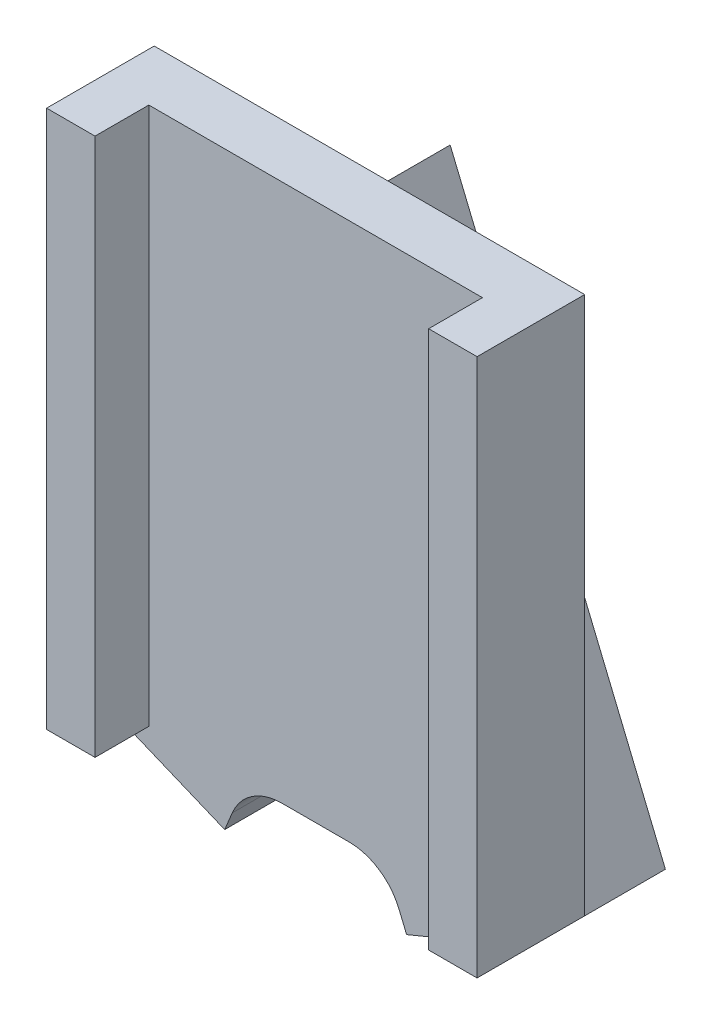
ISO-10303-21;
HEADER;
FILE_DESCRIPTION(('STEP AP214'),'2;1');
FILE_NAME('part.step','',(''),(''),'','','');
FILE_SCHEMA(('AUTOMOTIVE_DESIGN { 1 0 10303 214 1 1 1 1 }'));
ENDSEC;
DATA;
#1=APPLICATION_CONTEXT('core data for automotive mechanical design processes');
#2=APPLICATION_PROTOCOL_DEFINITION('international standard','automotive_design',2000,#1);
#3=PRODUCT_CONTEXT('',#1,'mechanical');
#4=PRODUCT('Part','Part','',(#3));
#5=PRODUCT_RELATED_PRODUCT_CATEGORY('part','',(#4));
#6=PRODUCT_DEFINITION_FORMATION('','',#4);
#7=PRODUCT_DEFINITION_CONTEXT('part definition',#1,'design');
#8=PRODUCT_DEFINITION('design','',#6,#7);
#9=PRODUCT_DEFINITION_SHAPE('','',#8);
#10=(LENGTH_UNIT() NAMED_UNIT(*) SI_UNIT(.MILLI.,.METRE.));
#11=(NAMED_UNIT(*) PLANE_ANGLE_UNIT() SI_UNIT($,.RADIAN.));
#12=(NAMED_UNIT(*) SI_UNIT($,.STERADIAN.) SOLID_ANGLE_UNIT());
#13=UNCERTAINTY_MEASURE_WITH_UNIT(LENGTH_MEASURE(1.E-05),#10,'distance_accuracy_value','');
#14=(GEOMETRIC_REPRESENTATION_CONTEXT(3) GLOBAL_UNCERTAINTY_ASSIGNED_CONTEXT((#13)) GLOBAL_UNIT_ASSIGNED_CONTEXT((#10,
#11,#12)) REPRESENTATION_CONTEXT('',''));
#15=CARTESIAN_POINT('',(0.,0.,0.));
#16=DIRECTION('',(0.,0.,1.));
#17=DIRECTION('',(1.,0.,0.));
#18=AXIS2_PLACEMENT_3D('',#15,#16,#17);
#19=CARTESIAN_POINT('',(2.30969883127822,-10.9567085809127,1.));
#20=DIRECTION('',(0.923879532511288,-0.382683432365087,0.));
#21=DIRECTION('',(0.382683432365087,0.923879532511288,0.));
#22=AXIS2_PLACEMENT_3D('',#19,#20,#21);
#23=PLANE('',#22);
#24=DIRECTION('',(0.382683432365087,0.923879532511288,0.));
#25=VECTOR('',#24,1.);
#26=CARTESIAN_POINT('',(5.84523273721094,-2.42117467497996,0.));
#27=LINE('',#26,#25);
#28=CARTESIAN_POINT('',(2.450279606139,-10.6173165676349,0.));
#29=VERTEX_POINT('',#28);
#30=CARTESIAN_POINT('',(3.71016818448233,-7.57567647471944,0.));
#31=VERTEX_POINT('',#30);
#32=EDGE_CURVE('E206',#29,#31,#27,.T.);
#33=ORIENTED_EDGE('',*,*,#32,.F.);
#34=DIRECTION('',(0.,0.,-1.));
#35=VECTOR('',#34,1.);
#36=CARTESIAN_POINT('',(2.450279606139,-10.6173165676349,1.));
#37=LINE('',#36,#35);
#38=CARTESIAN_POINT('',(2.450279606139,-10.6173165676349,1.));
#39=VERTEX_POINT('',#38);
#40=EDGE_CURVE('E295',#29,#39,#37,.F.);
#41=ORIENTED_EDGE('',*,*,#40,.T.);
#42=DIRECTION('',(-0.382683432365087,-0.923879532511288,0.));
#43=VECTOR('',#42,1.);
#44=CARTESIAN_POINT('',(2.30969883127822,-10.9567085809127,1.));
#45=LINE('',#44,#43);
#46=CARTESIAN_POINT('',(2.30969883127822,-10.9567085809127,1.));
#47=VERTEX_POINT('',#46);
#48=EDGE_CURVE('E307',#39,#47,#45,.T.);
#49=ORIENTED_EDGE('',*,*,#48,.T.);
#50=DIRECTION('',(0.,0.,-1.));
#51=VECTOR('',#50,1.);
#52=CARTESIAN_POINT('',(2.30969883127822,-10.9567085809127,1.));
#53=LINE('',#52,#51);
#54=CARTESIAN_POINT('',(2.30969883127822,-10.9567085809127,-1.5));
#55=VERTEX_POINT('',#54);
#56=EDGE_CURVE('E347',#47,#55,#53,.T.);
#57=ORIENTED_EDGE('',*,*,#56,.T.);
#58=DIRECTION('',(-0.382683432365087,-0.923879532511288,0.));
#59=VECTOR('',#58,1.);
#60=CARTESIAN_POINT('',(2.30969883127822,-10.9567085809127,-1.5));
#61=LINE('',#60,#59);
#62=CARTESIAN_POINT('',(3.71016818448233,-7.57567647471944,-1.5));
#63=VERTEX_POINT('',#62);
#64=EDGE_CURVE('E360',#63,#55,#61,.T.);
#65=ORIENTED_EDGE('',*,*,#64,.F.);
#66=DIRECTION('',(0.,0.,-1.));
#67=VECTOR('',#66,1.);
#68=CARTESIAN_POINT('',(3.71016818448233,-7.57567647471944,0.));
#69=LINE('',#68,#67);
#70=EDGE_CURVE('E197',#31,#63,#69,.T.);
#71=ORIENTED_EDGE('',*,*,#70,.F.);
#72=EDGE_LOOP('',(#33,#41,#49,#57,#65,#71));
#73=FACE_BOUND('',#72,.T.);
#74=ADVANCED_FACE('F32',(#73),#23,.T.);
#75=CARTESIAN_POINT('',(3.99999999999999,-6.8759605748895,1.));
#76=DIRECTION('',(-0.923879532511288,-0.382683432365088,0.));
#77=DIRECTION('',(0.382683432365088,-0.923879532511288,0.));
#78=AXIS2_PLACEMENT_3D('',#75,#76,#77);
#79=PLANE('',#78);
#80=DIRECTION('',(0.,0.,-1.));
#81=VECTOR('',#80,1.);
#82=CARTESIAN_POINT('',(4.01000933746841,-6.90012525315614,0.));
#83=LINE('',#82,#81);
#84=CARTESIAN_POINT('',(4.01000933746841,-6.90012525315614,0.));
#85=VERTEX_POINT('',#84);
#86=CARTESIAN_POINT('',(4.01000933746841,-6.90012525315614,-1.5));
#87=VERTEX_POINT('',#86);
#88=EDGE_CURVE('E198',#85,#87,#83,.T.);
#89=ORIENTED_EDGE('',*,*,#88,.F.);
#90=DIRECTION('',(0.382683432365088,-0.923879532511288,0.));
#91=VECTOR('',#90,1.);
#92=CARTESIAN_POINT('',(0.983194387535245,0.407252449766205,0.));
#93=LINE('',#92,#91);
#94=CARTESIAN_POINT('',(3.99999999999999,-6.8759605748895,0.));
#95=VERTEX_POINT('',#94);
#96=EDGE_CURVE('E213',#95,#85,#93,.T.);
#97=ORIENTED_EDGE('',*,*,#96,.F.);
#98=DIRECTION('',(0.,0.,-1.));
#99=VECTOR('',#98,1.);
#100=CARTESIAN_POINT('',(3.99999999999999,-6.8759605748895,1.));
#101=LINE('',#100,#99);
#102=CARTESIAN_POINT('',(3.99999999999999,-6.8759605748895,-1.5));
#103=VERTEX_POINT('',#102);
#104=EDGE_CURVE('E212',#95,#103,#101,.T.);
#105=ORIENTED_EDGE('',*,*,#104,.T.);
#106=DIRECTION('',(-0.382683432365088,0.923879532511288,0.));
#107=VECTOR('',#106,1.);
#108=CARTESIAN_POINT('',(3.99999999999999,-6.8759605748895,-1.5));
#109=LINE('',#108,#107);
#110=EDGE_CURVE('E361',#87,#103,#109,.T.);
#111=ORIENTED_EDGE('',*,*,#110,.F.);
#112=EDGE_LOOP('',(#89,#97,#105,#111));
#113=FACE_BOUND('',#112,.T.);
#114=ADVANCED_FACE('F436',(#113),#79,.T.);
#115=CARTESIAN_POINT('',(0.,-10.,2.));
#116=DIRECTION('',(0.,1.,0.));
#117=DIRECTION('',(0.,0.,1.));
#118=AXIS2_PLACEMENT_3D('',#115,#116,#117);
#119=PLANE('',#118);
#120=DIRECTION('',(1.,0.,0.));
#121=VECTOR('',#120,1.);
#122=CARTESIAN_POINT('',(0.900000000000001,-10.,1.));
#123=LINE('',#122,#121);
#124=CARTESIAN_POINT('',(3.37415913865028,-10.,1.));
#125=VERTEX_POINT('',#124);
#126=CARTESIAN_POINT('',(4.6258408613497,-10.,1.));
#127=VERTEX_POINT('',#126);
#128=EDGE_CURVE('E230',#125,#127,#123,.T.);
#129=ORIENTED_EDGE('',*,*,#128,.F.);
#130=DIRECTION('',(0.,0.,-1.));
#131=VECTOR('',#130,1.);
#132=CARTESIAN_POINT('',(3.37415913865028,-10.,2.));
#133=LINE('',#132,#131);
#134=CARTESIAN_POINT('',(3.37415913865028,-10.,0.));
#135=VERTEX_POINT('',#134);
#136=EDGE_CURVE('E292',#125,#135,#133,.T.);
#137=ORIENTED_EDGE('',*,*,#136,.T.);
#138=DIRECTION('',(1.,0.,0.));
#139=VECTOR('',#138,1.);
#140=CARTESIAN_POINT('',(0.,-10.,0.));
#141=LINE('',#140,#139);
#142=CARTESIAN_POINT('',(4.6258408613497,-10.,0.));
#143=VERTEX_POINT('',#142);
#144=EDGE_CURVE('E269',#135,#143,#141,.T.);
#145=ORIENTED_EDGE('',*,*,#144,.T.);
#146=DIRECTION('',(0.,0.,1.));
#147=VECTOR('',#146,1.);
#148=CARTESIAN_POINT('',(4.6258408613497,-10.,2.));
#149=LINE('',#148,#147);
#150=EDGE_CURVE('E289',#143,#127,#149,.T.);
#151=ORIENTED_EDGE('',*,*,#150,.T.);
#152=EDGE_LOOP('',(#129,#137,#145,#151));
#153=FACE_BOUND('',#152,.T.);
#154=ADVANCED_FACE('F312',(#153),#119,.F.);
#155=DIRECTION('',(0.,0.,-1.));
#156=VECTOR('',#155,1.);
#157=CARTESIAN_POINT('',(0.,-10.,2.));
#158=LINE('',#157,#156);
#159=CARTESIAN_POINT('',(0.,-10.,2.));
#160=VERTEX_POINT('',#159);
#161=CARTESIAN_POINT('',(0.,-10.,1.));
#162=VERTEX_POINT('',#161);
#163=EDGE_CURVE('E283',#160,#162,#158,.T.);
#164=ORIENTED_EDGE('',*,*,#163,.T.);
#165=DIRECTION('',(1.,0.,0.));
#166=VECTOR('',#165,1.);
#167=CARTESIAN_POINT('',(0.,-10.,1.));
#168=LINE('',#167,#166);
#169=CARTESIAN_POINT('',(0.900000000000001,-10.,1.));
#170=VERTEX_POINT('',#169);
#171=EDGE_CURVE('E227',#162,#170,#168,.T.);
#172=ORIENTED_EDGE('',*,*,#171,.T.);
#173=DIRECTION('',(0.,0.,1.));
#174=VECTOR('',#173,1.);
#175=CARTESIAN_POINT('',(0.900000000000001,-10.,1.));
#176=LINE('',#175,#174);
#177=CARTESIAN_POINT('',(0.900000000000001,-10.,2.));
#178=VERTEX_POINT('',#177);
#179=EDGE_CURVE('E238',#170,#178,#176,.T.);
#180=ORIENTED_EDGE('',*,*,#179,.T.);
#181=DIRECTION('',(1.,0.,0.));
#182=VECTOR('',#181,1.);
#183=CARTESIAN_POINT('',(0.,-10.,2.));
#184=LINE('',#183,#182);
#185=EDGE_CURVE('E257',#160,#178,#184,.T.);
#186=ORIENTED_EDGE('',*,*,#185,.F.);
#187=EDGE_LOOP('',(#164,#172,#180,#186));
#188=FACE_BOUND('',#187,.T.);
#189=ADVANCED_FACE('F428',(#188),#119,.F.);
#190=CARTESIAN_POINT('',(0.,0.,0.));
#191=DIRECTION('',(0.,0.,1.));
#192=DIRECTION('',(1.,0.,0.));
#193=AXIS2_PLACEMENT_3D('',#190,#191,#192);
#194=PLANE('',#193);
#195=DIRECTION('',(0.,1.,0.));
#196=VECTOR('',#195,1.);
#197=CARTESIAN_POINT('',(7.99999999999998,0.,0.));
#198=LINE('',#197,#196);
#199=CARTESIAN_POINT('',(7.99999999999998,-10.,0.));
#200=VERTEX_POINT('',#199);
#201=CARTESIAN_POINT('',(7.99999999999998,0.,0.));
#202=VERTEX_POINT('',#201);
#203=EDGE_CURVE('E272',#200,#202,#198,.T.);
#204=ORIENTED_EDGE('',*,*,#203,.F.);
#205=DIRECTION('',(-0.382683432365088,0.923879532511288,0.));
#206=VECTOR('',#205,1.);
#207=CARTESIAN_POINT('',(3.29289321881346,1.36396103067892,0.));
#208=LINE('',#207,#206);
#209=CARTESIAN_POINT('',(3.99999999999999,-0.343145750507577,0.));
#210=VERTEX_POINT('',#209);
#211=EDGE_CURVE('E221',#200,#210,#208,.T.);
#212=ORIENTED_EDGE('',*,*,#211,.T.);
#213=DIRECTION('',(-0.382683432365087,-0.923879532511288,0.));
#214=VECTOR('',#213,1.);
#215=CARTESIAN_POINT('',(3.53553390593272,-1.46446609406724,0.));
#216=LINE('',#215,#214);
#217=CARTESIAN_POINT('',(0.,-10.,0.));
#218=VERTEX_POINT('',#217);
#219=EDGE_CURVE('E215',#210,#218,#216,.T.);
#220=ORIENTED_EDGE('',*,*,#219,.T.);
#221=DIRECTION('',(0.,-1.,0.));
#222=VECTOR('',#221,1.);
#223=CARTESIAN_POINT('',(0.,0.,0.));
#224=LINE('',#223,#222);
#225=CARTESIAN_POINT('',(0.,0.,0.));
#226=VERTEX_POINT('',#225);
#227=EDGE_CURVE('E244',#226,#218,#224,.T.);
#228=ORIENTED_EDGE('',*,*,#227,.F.);
#229=DIRECTION('',(-1.,0.,0.));
#230=VECTOR('',#229,1.);
#231=CARTESIAN_POINT('',(0.,0.,0.));
#232=LINE('',#231,#230);
#233=EDGE_CURVE('E256',#202,#226,#232,.T.);
#234=ORIENTED_EDGE('',*,*,#233,.F.);
#235=EDGE_LOOP('',(#204,#212,#220,#228,#234));
#236=FACE_BOUND('',#235,.T.);
#237=ADVANCED_FACE('F394',(#236),#194,.F.);
#238=CARTESIAN_POINT('',(0.,0.,2.));
#239=DIRECTION('',(0.,0.,1.));
#240=DIRECTION('',(1.,0.,0.));
#241=AXIS2_PLACEMENT_3D('',#238,#239,#240);
#242=PLANE('',#241);
#243=DIRECTION('',(0.,-1.,0.));
#244=VECTOR('',#243,1.);
#245=CARTESIAN_POINT('',(0.9,0.,2.));
#246=LINE('',#245,#244);
#247=CARTESIAN_POINT('',(0.9,0.,2.));
#248=VERTEX_POINT('',#247);
#249=EDGE_CURVE('E239',#248,#178,#246,.T.);
#250=ORIENTED_EDGE('',*,*,#249,.F.);
#251=DIRECTION('',(-1.,0.,0.));
#252=VECTOR('',#251,1.);
#253=CARTESIAN_POINT('',(0.,0.,2.));
#254=LINE('',#253,#252);
#255=CARTESIAN_POINT('',(0.,0.,2.));
#256=VERTEX_POINT('',#255);
#257=EDGE_CURVE('E262',#248,#256,#254,.T.);
#258=ORIENTED_EDGE('',*,*,#257,.T.);
#259=DIRECTION('',(0.,-1.,0.));
#260=VECTOR('',#259,1.);
#261=CARTESIAN_POINT('',(0.,0.,2.));
#262=LINE('',#261,#260);
#263=EDGE_CURVE('E252',#256,#160,#262,.T.);
#264=ORIENTED_EDGE('',*,*,#263,.T.);
#265=ORIENTED_EDGE('',*,*,#185,.T.);
#266=EDGE_LOOP('',(#250,#258,#264,#265));
#267=FACE_BOUND('',#266,.T.);
#268=ADVANCED_FACE('F408',(#267),#242,.T.);
#269=CARTESIAN_POINT('',(0.,0.,2.));
#270=DIRECTION('',(1.,0.,0.));
#271=DIRECTION('',(0.,1.,0.));
#272=AXIS2_PLACEMENT_3D('',#269,#270,#271);
#273=PLANE('',#272);
#274=ORIENTED_EDGE('',*,*,#227,.T.);
#275=DIRECTION('',(0.,0.,-1.));
#276=VECTOR('',#275,1.);
#277=CARTESIAN_POINT('',(0.,-10.,1.));
#278=LINE('',#277,#276);
#279=EDGE_CURVE('E343',#162,#218,#278,.T.);
#280=ORIENTED_EDGE('',*,*,#279,.F.);
#281=ORIENTED_EDGE('',*,*,#163,.F.);
#282=ORIENTED_EDGE('',*,*,#263,.F.);
#283=DIRECTION('',(0.,0.,-1.));
#284=VECTOR('',#283,1.);
#285=CARTESIAN_POINT('',(0.,0.,2.));
#286=LINE('',#285,#284);
#287=EDGE_CURVE('E266',#256,#226,#286,.T.);
#288=ORIENTED_EDGE('',*,*,#287,.T.);
#289=EDGE_LOOP('',(#274,#280,#281,#282,#288));
#290=FACE_BOUND('',#289,.T.);
#291=ADVANCED_FACE('F403',(#290),#273,.F.);
#292=DIRECTION('',(0.,0.,1.));
#293=VECTOR('',#292,1.);
#294=CARTESIAN_POINT('',(7.09999999999998,-10.,1.));
#295=LINE('',#294,#293);
#296=CARTESIAN_POINT('',(7.09999999999998,-10.,1.));
#297=VERTEX_POINT('',#296);
#298=CARTESIAN_POINT('',(7.09999999999998,-10.,2.));
#299=VERTEX_POINT('',#298);
#300=EDGE_CURVE('E248',#297,#299,#295,.T.);
#301=ORIENTED_EDGE('',*,*,#300,.F.);
#302=CARTESIAN_POINT('',(7.99999999999998,-10.,1.));
#303=VERTEX_POINT('',#302);
#304=EDGE_CURVE('E224',#297,#303,#168,.T.);
#305=ORIENTED_EDGE('',*,*,#304,.T.);
#306=DIRECTION('',(0.,0.,-1.));
#307=VECTOR('',#306,1.);
#308=CARTESIAN_POINT('',(7.99999999999998,-10.,2.));
#309=LINE('',#308,#307);
#310=CARTESIAN_POINT('',(7.99999999999998,-10.,2.));
#311=VERTEX_POINT('',#310);
#312=EDGE_CURVE('E280',#311,#303,#309,.T.);
#313=ORIENTED_EDGE('',*,*,#312,.F.);
#314=EDGE_CURVE('E255',#299,#311,#184,.T.);
#315=ORIENTED_EDGE('',*,*,#314,.F.);
#316=EDGE_LOOP('',(#301,#305,#313,#315));
#317=FACE_BOUND('',#316,.T.);
#318=ADVANCED_FACE('F425',(#317),#119,.F.);
#319=CARTESIAN_POINT('',(7.99999999999998,0.,2.));
#320=DIRECTION('',(-1.,0.,0.));
#321=DIRECTION('',(0.,-1.,0.));
#322=AXIS2_PLACEMENT_3D('',#319,#320,#321);
#323=PLANE('',#322);
#324=ORIENTED_EDGE('',*,*,#203,.T.);
#325=DIRECTION('',(0.,0.,-1.));
#326=VECTOR('',#325,1.);
#327=CARTESIAN_POINT('',(7.99999999999998,0.,2.));
#328=LINE('',#327,#326);
#329=CARTESIAN_POINT('',(7.99999999999998,0.,2.));
#330=VERTEX_POINT('',#329);
#331=EDGE_CURVE('E277',#330,#202,#328,.T.);
#332=ORIENTED_EDGE('',*,*,#331,.F.);
#333=DIRECTION('',(0.,1.,0.));
#334=VECTOR('',#333,1.);
#335=CARTESIAN_POINT('',(7.99999999999998,0.,2.));
#336=LINE('',#335,#334);
#337=EDGE_CURVE('E260',#311,#330,#336,.T.);
#338=ORIENTED_EDGE('',*,*,#337,.F.);
#339=ORIENTED_EDGE('',*,*,#312,.T.);
#340=DIRECTION('',(0.,0.,-1.));
#341=VECTOR('',#340,1.);
#342=CARTESIAN_POINT('',(7.99999999999998,-10.,1.));
#343=LINE('',#342,#341);
#344=EDGE_CURVE('E337',#303,#200,#343,.T.);
#345=ORIENTED_EDGE('',*,*,#344,.T.);
#346=EDGE_LOOP('',(#324,#332,#338,#339,#345));
#347=FACE_BOUND('',#346,.T.);
#348=ADVANCED_FACE('F388',(#347),#323,.F.);
#349=CARTESIAN_POINT('',(0.,0.,2.));
#350=DIRECTION('',(0.,-1.,0.));
#351=DIRECTION('',(0.,0.,-1.));
#352=AXIS2_PLACEMENT_3D('',#349,#350,#351);
#353=PLANE('',#352);
#354=ORIENTED_EDGE('',*,*,#257,.F.);
#355=DIRECTION('',(0.,0.,1.));
#356=VECTOR('',#355,1.);
#357=CARTESIAN_POINT('',(0.9,0.,1.));
#358=LINE('',#357,#356);
#359=CARTESIAN_POINT('',(0.9,0.,1.));
#360=VERTEX_POINT('',#359);
#361=EDGE_CURVE('E242',#360,#248,#358,.T.);
#362=ORIENTED_EDGE('',*,*,#361,.F.);
#363=DIRECTION('',(-1.,0.,0.));
#364=VECTOR('',#363,1.);
#365=CARTESIAN_POINT('',(0.9,0.,1.));
#366=LINE('',#365,#364);
#367=CARTESIAN_POINT('',(7.09999999999998,0.,1.));
#368=VERTEX_POINT('',#367);
#369=EDGE_CURVE('E235',#368,#360,#366,.T.);
#370=ORIENTED_EDGE('',*,*,#369,.F.);
#371=DIRECTION('',(0.,0.,1.));
#372=VECTOR('',#371,1.);
#373=CARTESIAN_POINT('',(7.09999999999998,0.,1.));
#374=LINE('',#373,#372);
#375=CARTESIAN_POINT('',(7.09999999999998,0.,2.));
#376=VERTEX_POINT('',#375);
#377=EDGE_CURVE('E245',#368,#376,#374,.T.);
#378=ORIENTED_EDGE('',*,*,#377,.T.);
#379=EDGE_CURVE('E263',#330,#376,#254,.T.);
#380=ORIENTED_EDGE('',*,*,#379,.F.);
#381=ORIENTED_EDGE('',*,*,#331,.T.);
#382=ORIENTED_EDGE('',*,*,#233,.T.);
#383=ORIENTED_EDGE('',*,*,#287,.F.);
#384=EDGE_LOOP('',(#354,#362,#370,#378,#380,#381,#382,#383));
#385=FACE_BOUND('',#384,.T.);
#386=ADVANCED_FACE('F399',(#385),#353,.F.);
#387=DIRECTION('',(0.,1.,0.));
#388=VECTOR('',#387,1.);
#389=CARTESIAN_POINT('',(7.09999999999998,0.,2.));
#390=LINE('',#389,#388);
#391=EDGE_CURVE('E231',#299,#376,#390,.T.);
#392=ORIENTED_EDGE('',*,*,#391,.F.);
#393=ORIENTED_EDGE('',*,*,#314,.T.);
#394=ORIENTED_EDGE('',*,*,#337,.T.);
#395=ORIENTED_EDGE('',*,*,#379,.T.);
#396=EDGE_LOOP('',(#392,#393,#394,#395));
#397=FACE_BOUND('',#396,.T.);
#398=ADVANCED_FACE('F422',(#397),#242,.T.);
#399=ORIENTED_EDGE('',*,*,#32,.T.);
#400=CARTESIAN_POINT('',(3.99999999999999,-7.3,0.));
#401=DIRECTION('',(0.,0.,-1.));
#402=DIRECTION('',(-1.,0.,0.));
#403=AXIS2_PLACEMENT_3D('',#400,#401,#402);
#404=CIRCLE('',#403,0.4);
#405=CARTESIAN_POINT('',(3.98999066253156,-6.90012525315614,0.));
#406=VERTEX_POINT('',#405);
#407=EDGE_CURVE('E189',#31,#406,#404,.T.);
#408=ORIENTED_EDGE('',*,*,#407,.T.);
#409=EDGE_CURVE('E203',#406,#95,#27,.T.);
#410=ORIENTED_EDGE('',*,*,#409,.T.);
#411=ORIENTED_EDGE('',*,*,#96,.T.);
#412=CARTESIAN_POINT('',(4.28983181551765,-7.57567647471944,0.));
#413=VERTEX_POINT('',#412);
#414=EDGE_CURVE('E207',#85,#413,#404,.T.);
#415=ORIENTED_EDGE('',*,*,#414,.T.);
#416=CARTESIAN_POINT('',(5.54972039386099,-10.6173165676349,0.));
#417=VERTEX_POINT('',#416);
#418=EDGE_CURVE('E46',#413,#417,#93,.T.);
#419=ORIENTED_EDGE('',*,*,#418,.T.);
#420=CARTESIAN_POINT('',(4.6258408613497,-11.,0.));
#421=DIRECTION('',(0.,0.,1.));
#422=DIRECTION('',(1.,0.,0.));
#423=AXIS2_PLACEMENT_3D('',#420,#421,#422);
#424=CIRCLE('',#423,1.);
#425=EDGE_CURVE('E11',#417,#143,#424,.T.);
#426=ORIENTED_EDGE('',*,*,#425,.T.);
#427=ORIENTED_EDGE('',*,*,#144,.F.);
#428=CARTESIAN_POINT('',(3.37415913865028,-11.,0.));
#429=DIRECTION('',(0.,0.,1.));
#430=DIRECTION('',(1.,0.,0.));
#431=AXIS2_PLACEMENT_3D('',#428,#429,#430);
#432=CIRCLE('',#431,1.);
#433=EDGE_CURVE('E299',#135,#29,#432,.T.);
#434=ORIENTED_EDGE('',*,*,#433,.T.);
#435=EDGE_LOOP('',(#399,#408,#410,#411,#415,#419,#426,#427,#434));
#436=FACE_BOUND('',#435,.T.);
#437=ADVANCED_FACE('F201',(#436),#194,.F.);
#438=CARTESIAN_POINT('',(0.9,0.,1.));
#439=DIRECTION('',(-1.,0.,0.));
#440=DIRECTION('',(0.,-1.,0.));
#441=AXIS2_PLACEMENT_3D('',#438,#439,#440);
#442=PLANE('',#441);
#443=ORIENTED_EDGE('',*,*,#249,.T.);
#444=ORIENTED_EDGE('',*,*,#179,.F.);
#445=DIRECTION('',(0.,-1.,0.));
#446=VECTOR('',#445,1.);
#447=CARTESIAN_POINT('',(0.9,0.,1.));
#448=LINE('',#447,#446);
#449=EDGE_CURVE('E228',#360,#170,#448,.T.);
#450=ORIENTED_EDGE('',*,*,#449,.F.);
#451=ORIENTED_EDGE('',*,*,#361,.T.);
#452=EDGE_LOOP('',(#443,#444,#450,#451));
#453=FACE_BOUND('',#452,.T.);
#454=ADVANCED_FACE('F412',(#453),#442,.F.);
#455=CARTESIAN_POINT('',(7.09999999999998,0.,1.));
#456=DIRECTION('',(1.,0.,0.));
#457=DIRECTION('',(0.,1.,0.));
#458=AXIS2_PLACEMENT_3D('',#455,#456,#457);
#459=PLANE('',#458);
#460=ORIENTED_EDGE('',*,*,#391,.T.);
#461=ORIENTED_EDGE('',*,*,#377,.F.);
#462=DIRECTION('',(0.,1.,0.));
#463=VECTOR('',#462,1.);
#464=CARTESIAN_POINT('',(7.09999999999998,0.,1.));
#465=LINE('',#464,#463);
#466=EDGE_CURVE('E233',#297,#368,#465,.T.);
#467=ORIENTED_EDGE('',*,*,#466,.F.);
#468=ORIENTED_EDGE('',*,*,#300,.T.);
#469=EDGE_LOOP('',(#460,#461,#467,#468));
#470=FACE_BOUND('',#469,.T.);
#471=ADVANCED_FACE('F419',(#470),#459,.F.);
#472=CARTESIAN_POINT('',(0.,0.,1.));
#473=DIRECTION('',(0.,0.,1.));
#474=DIRECTION('',(1.,0.,0.));
#475=AXIS2_PLACEMENT_3D('',#472,#473,#474);
#476=PLANE('',#475);
#477=ORIENTED_EDGE('',*,*,#449,.T.);
#478=ORIENTED_EDGE('',*,*,#171,.F.);
#479=DIRECTION('',(-0.923879532511288,0.382683432365087,0.));
#480=VECTOR('',#479,1.);
#481=CARTESIAN_POINT('',(0.,-10.,1.));
#482=LINE('',#481,#480);
#483=EDGE_CURVE('E329',#47,#162,#482,.T.);
#484=ORIENTED_EDGE('',*,*,#483,.F.);
#485=ORIENTED_EDGE('',*,*,#48,.F.);
#486=CARTESIAN_POINT('',(3.37415913865028,-11.,1.));
#487=DIRECTION('',(0.,0.,1.));
#488=DIRECTION('',(1.,0.,0.));
#489=AXIS2_PLACEMENT_3D('',#486,#487,#488);
#490=CIRCLE('',#489,1.);
#491=EDGE_CURVE('E301',#39,#125,#490,.F.);
#492=ORIENTED_EDGE('',*,*,#491,.T.);
#493=ORIENTED_EDGE('',*,*,#128,.T.);
#494=CARTESIAN_POINT('',(4.6258408613497,-11.,1.));
#495=DIRECTION('',(0.,0.,1.));
#496=DIRECTION('',(1.,0.,0.));
#497=AXIS2_PLACEMENT_3D('',#494,#495,#496);
#498=CIRCLE('',#497,1.);
#499=CARTESIAN_POINT('',(5.54972039386099,-10.6173165676349,1.));
#500=VERTEX_POINT('',#499);
#501=EDGE_CURVE('E40',#127,#500,#498,.F.);
#502=ORIENTED_EDGE('',*,*,#501,.T.);
#503=DIRECTION('',(-0.382683432365088,0.923879532511288,0.));
#504=VECTOR('',#503,1.);
#505=CARTESIAN_POINT('',(3.99999999999999,-6.8759605748895,1.));
#506=LINE('',#505,#504);
#507=CARTESIAN_POINT('',(5.69030116872176,-10.9567085809127,1.));
#508=VERTEX_POINT('',#507);
#509=EDGE_CURVE('E322',#508,#500,#506,.T.);
#510=ORIENTED_EDGE('',*,*,#509,.F.);
#511=DIRECTION('',(-0.923879532511288,-0.382683432365088,0.));
#512=VECTOR('',#511,1.);
#513=CARTESIAN_POINT('',(7.99999999999998,-10.,1.));
#514=LINE('',#513,#512);
#515=EDGE_CURVE('E327',#303,#508,#514,.T.);
#516=ORIENTED_EDGE('',*,*,#515,.F.);
#517=ORIENTED_EDGE('',*,*,#304,.F.);
#518=ORIENTED_EDGE('',*,*,#466,.T.);
#519=ORIENTED_EDGE('',*,*,#369,.T.);
#520=EDGE_LOOP('',(#477,#478,#484,#485,#492,#493,#502,#510,#516,#517,#518,#519));
#521=FACE_BOUND('',#520,.T.);
#522=ADVANCED_FACE('F305',(#521),#476,.T.);
#523=CARTESIAN_POINT('',(7.99999999999998,-10.,1.));
#524=DIRECTION('',(0.923879532511288,0.382683432365088,0.));
#525=DIRECTION('',(-0.382683432365088,0.923879532511288,0.));
#526=AXIS2_PLACEMENT_3D('',#523,#524,#525);
#527=PLANE('',#526);
#528=ORIENTED_EDGE('',*,*,#211,.F.);
#529=CARTESIAN_POINT('',(7.99999999999998,-10.,-1.5));
#530=VERTEX_POINT('',#529);
#531=EDGE_CURVE('E340',#200,#530,#343,.T.);
#532=ORIENTED_EDGE('',*,*,#531,.T.);
#533=DIRECTION('',(0.382683432365088,-0.923879532511288,0.));
#534=VECTOR('',#533,1.);
#535=CARTESIAN_POINT('',(7.99999999999998,-10.,-1.5));
#536=LINE('',#535,#534);
#537=CARTESIAN_POINT('',(3.99999999999999,-0.343145750507577,-1.5));
#538=VERTEX_POINT('',#537);
#539=EDGE_CURVE('E331',#538,#530,#536,.T.);
#540=ORIENTED_EDGE('',*,*,#539,.F.);
#541=DIRECTION('',(0.,0.,-1.));
#542=VECTOR('',#541,1.);
#543=CARTESIAN_POINT('',(3.99999999999999,-0.343145750507577,1.));
#544=LINE('',#543,#542);
#545=EDGE_CURVE('E341',#210,#538,#544,.T.);
#546=ORIENTED_EDGE('',*,*,#545,.F.);
#547=EDGE_LOOP('',(#528,#532,#540,#546));
#548=FACE_BOUND('',#547,.T.);
#549=ADVANCED_FACE('F385',(#548),#527,.T.);
#550=CARTESIAN_POINT('',(0.,-10.,1.));
#551=DIRECTION('',(-0.923879532511288,0.382683432365087,0.));
#552=DIRECTION('',(-0.382683432365087,-0.923879532511288,0.));
#553=AXIS2_PLACEMENT_3D('',#550,#551,#552);
#554=PLANE('',#553);
#555=ORIENTED_EDGE('',*,*,#219,.F.);
#556=ORIENTED_EDGE('',*,*,#545,.T.);
#557=DIRECTION('',(0.382683432365087,0.923879532511288,0.));
#558=VECTOR('',#557,1.);
#559=CARTESIAN_POINT('',(0.,-10.,-1.5));
#560=LINE('',#559,#558);
#561=CARTESIAN_POINT('',(0.,-10.,-1.5));
#562=VERTEX_POINT('',#561);
#563=EDGE_CURVE('E379',#562,#538,#560,.T.);
#564=ORIENTED_EDGE('',*,*,#563,.F.);
#565=EDGE_CURVE('E346',#218,#562,#278,.T.);
#566=ORIENTED_EDGE('',*,*,#565,.F.);
#567=EDGE_LOOP('',(#555,#556,#564,#566));
#568=FACE_BOUND('',#567,.T.);
#569=ADVANCED_FACE('F449',(#568),#554,.T.);
#570=DIRECTION('',(0.,0.,-1.));
#571=VECTOR('',#570,1.);
#572=CARTESIAN_POINT('',(3.98999066253156,-6.90012525315614,0.));
#573=LINE('',#572,#571);
#574=CARTESIAN_POINT('',(3.98999066253156,-6.90012525315614,-1.5));
#575=VERTEX_POINT('',#574);
#576=EDGE_CURVE('E186',#575,#406,#573,.F.);
#577=ORIENTED_EDGE('',*,*,#576,.F.);
#578=EDGE_CURVE('E374',#103,#575,#61,.T.);
#579=ORIENTED_EDGE('',*,*,#578,.F.);
#580=ORIENTED_EDGE('',*,*,#104,.F.);
#581=ORIENTED_EDGE('',*,*,#409,.F.);
#582=EDGE_LOOP('',(#577,#579,#580,#581));
#583=FACE_BOUND('',#582,.T.);
#584=ADVANCED_FACE('F210',(#583),#23,.T.);
#585=ORIENTED_EDGE('',*,*,#509,.T.);
#586=DIRECTION('',(0.,0.,1.));
#587=VECTOR('',#586,1.);
#588=CARTESIAN_POINT('',(5.54972039386099,-10.6173165676349,1.));
#589=LINE('',#588,#587);
#590=EDGE_CURVE('E297',#500,#417,#589,.F.);
#591=ORIENTED_EDGE('',*,*,#590,.T.);
#592=ORIENTED_EDGE('',*,*,#418,.F.);
#593=DIRECTION('',(0.,0.,-1.));
#594=VECTOR('',#593,1.);
#595=CARTESIAN_POINT('',(4.28983181551765,-7.57567647471944,0.));
#596=LINE('',#595,#594);
#597=CARTESIAN_POINT('',(4.28983181551765,-7.57567647471944,-1.5));
#598=VERTEX_POINT('',#597);
#599=EDGE_CURVE('E358',#598,#413,#596,.F.);
#600=ORIENTED_EDGE('',*,*,#599,.F.);
#601=CARTESIAN_POINT('',(5.69030116872176,-10.9567085809127,-1.5));
#602=VERTEX_POINT('',#601);
#603=EDGE_CURVE('E357',#602,#598,#109,.T.);
#604=ORIENTED_EDGE('',*,*,#603,.F.);
#605=DIRECTION('',(0.,0.,-1.));
#606=VECTOR('',#605,1.);
#607=CARTESIAN_POINT('',(5.69030116872176,-10.9567085809127,1.));
#608=LINE('',#607,#606);
#609=EDGE_CURVE('E324',#508,#602,#608,.T.);
#610=ORIENTED_EDGE('',*,*,#609,.F.);
#611=EDGE_LOOP('',(#585,#591,#592,#600,#604,#610));
#612=FACE_BOUND('',#611,.T.);
#613=ADVANCED_FACE('F320',(#612),#79,.T.);
#614=CARTESIAN_POINT('',(7.99999999999998,-10.,1.));
#615=DIRECTION('',(0.382683432365088,-0.923879532511288,0.));
#616=DIRECTION('',(0.923879532511288,0.382683432365088,0.));
#617=AXIS2_PLACEMENT_3D('',#614,#615,#616);
#618=PLANE('',#617);
#619=CARTESIAN_POINT('',(6.84515058436087,-10.4783542904564,-0.25));
#620=DIRECTION('',(0.382683432365088,-0.923879532511288,0.));
#621=DIRECTION('',(0.923879532511288,0.382683432365088,0.));
#622=AXIS2_PLACEMENT_3D('',#619,#620,#621);
#623=CIRCLE('',#622,0.499999999999999);
#624=CARTESIAN_POINT('',(7.30709035061652,-10.2870125742738,-0.25));
#625=VERTEX_POINT('',#624);
#626=EDGE_CURVE('E475',#625,#625,#623,.T.);
#627=ORIENTED_EDGE('',*,*,#626,.F.);
#628=EDGE_LOOP('',(#627));
#629=FACE_BOUND('',#628,.T.);
#630=ORIENTED_EDGE('',*,*,#609,.T.);
#631=DIRECTION('',(-0.923879532511288,-0.382683432365088,0.));
#632=VECTOR('',#631,1.);
#633=CARTESIAN_POINT('',(7.99999999999998,-10.,-1.5));
#634=LINE('',#633,#632);
#635=EDGE_CURVE('E355',#530,#602,#634,.T.);
#636=ORIENTED_EDGE('',*,*,#635,.F.);
#637=ORIENTED_EDGE('',*,*,#531,.F.);
#638=ORIENTED_EDGE('',*,*,#344,.F.);
#639=ORIENTED_EDGE('',*,*,#515,.T.);
#640=EDGE_LOOP('',(#630,#636,#637,#638,#639));
#641=FACE_BOUND('',#640,.T.);
#642=ADVANCED_FACE('F352',(#629,#641),#618,.T.);
#643=CARTESIAN_POINT('',(0.,-10.,1.));
#644=DIRECTION('',(-0.382683432365087,-0.923879532511288,0.));
#645=DIRECTION('',(0.923879532511288,-0.382683432365087,0.));
#646=AXIS2_PLACEMENT_3D('',#643,#644,#645);
#647=PLANE('',#646);
#648=CARTESIAN_POINT('',(1.19102862325463,-10.4933402089266,-0.25));
#649=DIRECTION('',(-0.382683432365087,-0.923879532511288,0.));
#650=DIRECTION('',(0.923879532511288,-0.382683432365087,0.));
#651=AXIS2_PLACEMENT_3D('',#648,#649,#650);
#652=CIRCLE('',#651,0.599999999999999);
#653=CARTESIAN_POINT('',(1.7453563427614,-10.7229502683457,-0.25));
#654=VERTEX_POINT('',#653);
#655=EDGE_CURVE('E370',#654,#654,#652,.T.);
#656=ORIENTED_EDGE('',*,*,#655,.F.);
#657=EDGE_LOOP('',(#656));
#658=FACE_BOUND('',#657,.T.);
#659=ORIENTED_EDGE('',*,*,#279,.T.);
#660=ORIENTED_EDGE('',*,*,#565,.T.);
#661=DIRECTION('',(-0.923879532511288,0.382683432365087,0.));
#662=VECTOR('',#661,1.);
#663=CARTESIAN_POINT('',(0.,-10.,-1.5));
#664=LINE('',#663,#662);
#665=EDGE_CURVE('E376',#55,#562,#664,.T.);
#666=ORIENTED_EDGE('',*,*,#665,.F.);
#667=ORIENTED_EDGE('',*,*,#56,.F.);
#668=ORIENTED_EDGE('',*,*,#483,.T.);
#669=EDGE_LOOP('',(#659,#660,#666,#667,#668));
#670=FACE_BOUND('',#669,.T.);
#671=ADVANCED_FACE('F460',(#658,#670),#647,.T.);
#672=CARTESIAN_POINT('',(0.,0.,-1.5));
#673=DIRECTION('',(0.,0.,1.));
#674=DIRECTION('',(1.,0.,0.));
#675=AXIS2_PLACEMENT_3D('',#672,#673,#674);
#676=PLANE('',#675);
#677=ORIENTED_EDGE('',*,*,#578,.T.);
#678=CARTESIAN_POINT('',(3.99999999999999,-7.3,-1.5));
#679=DIRECTION('',(0.,0.,1.));
#680=DIRECTION('',(1.,0.,0.));
#681=AXIS2_PLACEMENT_3D('',#678,#679,#680);
#682=CIRCLE('',#681,0.4);
#683=EDGE_CURVE('E192',#575,#63,#682,.T.);
#684=ORIENTED_EDGE('',*,*,#683,.T.);
#685=ORIENTED_EDGE('',*,*,#64,.T.);
#686=ORIENTED_EDGE('',*,*,#665,.T.);
#687=ORIENTED_EDGE('',*,*,#563,.T.);
#688=ORIENTED_EDGE('',*,*,#539,.T.);
#689=ORIENTED_EDGE('',*,*,#635,.T.);
#690=ORIENTED_EDGE('',*,*,#603,.T.);
#691=EDGE_CURVE('E286',#598,#87,#682,.T.);
#692=ORIENTED_EDGE('',*,*,#691,.T.);
#693=ORIENTED_EDGE('',*,*,#110,.T.);
#694=EDGE_LOOP('',(#677,#684,#685,#686,#687,#688,#689,#690,#692,#693));
#695=FACE_BOUND('',#694,.T.);
#696=ADVANCED_FACE('F364',(#695),#676,.F.);
#697=CARTESIAN_POINT('',(3.10444578508007,-5.87394254637019,-0.25));
#698=DIRECTION('',(-0.382683432365087,-0.923879532511288,0.));
#699=DIRECTION('',(0.923879532511288,-0.382683432365087,0.));
#700=AXIS2_PLACEMENT_3D('',#697,#698,#699);
#701=CONICAL_SURFACE('',#700,0.599999999999999,1.02974425867665);
#702=CARTESIAN_POINT('',(3.24240942751756,-5.54086884968321,-0.250000000000001));
#703=VERTEX_POINT('',#702);
#704=VERTEX_LOOP('',#703);
#705=FACE_BOUND('',#704,.T.);
#706=CARTESIAN_POINT('',(3.10444578508007,-5.87394254637019,-0.25));
#707=DIRECTION('',(-0.382683432365087,-0.923879532511288,0.));
#708=DIRECTION('',(0.923879532511288,-0.382683432365087,0.));
#709=AXIS2_PLACEMENT_3D('',#706,#707,#708);
#710=CIRCLE('',#709,0.599999999999999);
#711=CARTESIAN_POINT('',(3.65877350458684,-6.10355260578924,-0.25));
#712=VERTEX_POINT('',#711);
#713=EDGE_CURVE('E367',#712,#712,#710,.T.);
#714=ORIENTED_EDGE('',*,*,#713,.T.);
#715=EDGE_LOOP('',(#714));
#716=FACE_BOUND('',#715,.T.);
#717=ADVANCED_FACE('F467',(#705,#716),#701,.F.);
#718=CARTESIAN_POINT('',(1.19102862325463,-10.4933402089266,-0.25));
#719=DIRECTION('',(-0.382683432365087,-0.923879532511288,0.));
#720=DIRECTION('',(0.923879532511288,-0.382683432365087,0.));
#721=AXIS2_PLACEMENT_3D('',#718,#719,#720);
#722=CYLINDRICAL_SURFACE('',#721,0.599999999999999);
#723=ORIENTED_EDGE('',*,*,#713,.F.);
#724=EDGE_LOOP('',(#723));
#725=FACE_BOUND('',#724,.T.);
#726=ORIENTED_EDGE('',*,*,#655,.T.);
#727=EDGE_LOOP('',(#726));
#728=FACE_BOUND('',#727,.T.);
#729=ADVANCED_FACE('F484',(#725,#728),#722,.F.);
#730=CARTESIAN_POINT('',(4.93173342253543,-5.85895662789992,-0.25));
#731=DIRECTION('',(0.382683432365088,-0.923879532511288,0.));
#732=DIRECTION('',(0.923879532511288,0.382683432365088,0.));
#733=AXIS2_PLACEMENT_3D('',#730,#731,#732);
#734=CONICAL_SURFACE('',#733,0.499999999999999,1.02974425867665);
#735=CARTESIAN_POINT('',(4.81676372050419,-5.58139521399411,-0.250000000000001));
#736=VERTEX_POINT('',#735);
#737=VERTEX_LOOP('',#736);
#738=FACE_BOUND('',#737,.T.);
#739=CARTESIAN_POINT('',(4.93173342253543,-5.85895662789992,-0.25));
#740=DIRECTION('',(0.382683432365088,-0.923879532511288,0.));
#741=DIRECTION('',(0.923879532511288,0.382683432365088,0.));
#742=AXIS2_PLACEMENT_3D('',#739,#740,#741);
#743=CIRCLE('',#742,0.499999999999999);
#744=CARTESIAN_POINT('',(5.39367318879107,-5.66761491171738,-0.25));
#745=VERTEX_POINT('',#744);
#746=EDGE_CURVE('E478',#745,#745,#743,.T.);
#747=ORIENTED_EDGE('',*,*,#746,.T.);
#748=EDGE_LOOP('',(#747));
#749=FACE_BOUND('',#748,.T.);
#750=ADVANCED_FACE('F486',(#738,#749),#734,.F.);
#751=CARTESIAN_POINT('',(6.84515058436087,-10.4783542904564,-0.25));
#752=DIRECTION('',(0.382683432365088,-0.923879532511288,0.));
#753=DIRECTION('',(0.923879532511288,0.382683432365088,0.));
#754=AXIS2_PLACEMENT_3D('',#751,#752,#753);
#755=CYLINDRICAL_SURFACE('',#754,0.499999999999999);
#756=ORIENTED_EDGE('',*,*,#746,.F.);
#757=EDGE_LOOP('',(#756));
#758=FACE_BOUND('',#757,.T.);
#759=ORIENTED_EDGE('',*,*,#626,.T.);
#760=EDGE_LOOP('',(#759));
#761=FACE_BOUND('',#760,.T.);
#762=ADVANCED_FACE('F493',(#758,#761),#755,.F.);
#763=CARTESIAN_POINT('',(3.99999999999999,-7.3,0.));
#764=DIRECTION('',(0.,0.,-1.));
#765=DIRECTION('',(-1.,0.,0.));
#766=AXIS2_PLACEMENT_3D('',#763,#764,#765);
#767=CYLINDRICAL_SURFACE('',#766,0.4);
#768=ORIENTED_EDGE('',*,*,#88,.T.);
#769=ORIENTED_EDGE('',*,*,#691,.F.);
#770=ORIENTED_EDGE('',*,*,#599,.T.);
#771=ORIENTED_EDGE('',*,*,#414,.F.);
#772=EDGE_LOOP('',(#768,#769,#770,#771));
#773=FACE_BOUND('',#772,.T.);
#774=ADVANCED_FACE('F502',(#773),#767,.F.);
#775=ORIENTED_EDGE('',*,*,#70,.T.);
#776=ORIENTED_EDGE('',*,*,#683,.F.);
#777=ORIENTED_EDGE('',*,*,#576,.T.);
#778=ORIENTED_EDGE('',*,*,#407,.F.);
#779=EDGE_LOOP('',(#775,#776,#777,#778));
#780=FACE_BOUND('',#779,.T.);
#781=ADVANCED_FACE('F188',(#780),#767,.F.);
#782=CARTESIAN_POINT('',(3.37415913865028,-11.,2.));
#783=DIRECTION('',(0.,0.,-1.));
#784=DIRECTION('',(-1.,0.,0.));
#785=AXIS2_PLACEMENT_3D('',#782,#783,#784);
#786=CYLINDRICAL_SURFACE('',#785,1.);
#787=ORIENTED_EDGE('',*,*,#491,.F.);
#788=ORIENTED_EDGE('',*,*,#40,.F.);
#789=ORIENTED_EDGE('',*,*,#433,.F.);
#790=ORIENTED_EDGE('',*,*,#136,.F.);
#791=EDGE_LOOP('',(#787,#788,#789,#790));
#792=FACE_BOUND('',#791,.T.);
#793=ADVANCED_FACE('F315',(#792),#786,.F.);
#794=CARTESIAN_POINT('',(4.6258408613497,-11.,2.));
#795=DIRECTION('',(0.,0.,1.));
#796=DIRECTION('',(1.,0.,0.));
#797=AXIS2_PLACEMENT_3D('',#794,#795,#796);
#798=CYLINDRICAL_SURFACE('',#797,1.);
#799=ORIENTED_EDGE('',*,*,#425,.F.);
#800=ORIENTED_EDGE('',*,*,#590,.F.);
#801=ORIENTED_EDGE('',*,*,#501,.F.);
#802=ORIENTED_EDGE('',*,*,#150,.F.);
#803=EDGE_LOOP('',(#799,#800,#801,#802));
#804=FACE_BOUND('',#803,.T.);
#805=ADVANCED_FACE('F34',(#804),#798,.F.);
#806=CLOSED_SHELL('',(#74,#114,#154,#189,#237,#268,#291,#318,#348,#386,#398,#437,#454,#471,#522,
#549,#569,#584,#613,#642,#671,#696,#717,#729,#750,#762,#774,#781,#793,#805));
#807=MANIFOLD_SOLID_BREP('B2',#806);
#808=ADVANCED_BREP_SHAPE_REPRESENTATION('',(#18,#807),#14);
#809=SHAPE_DEFINITION_REPRESENTATION(#9,#808);
ENDSEC;
END-ISO-10303-21;
